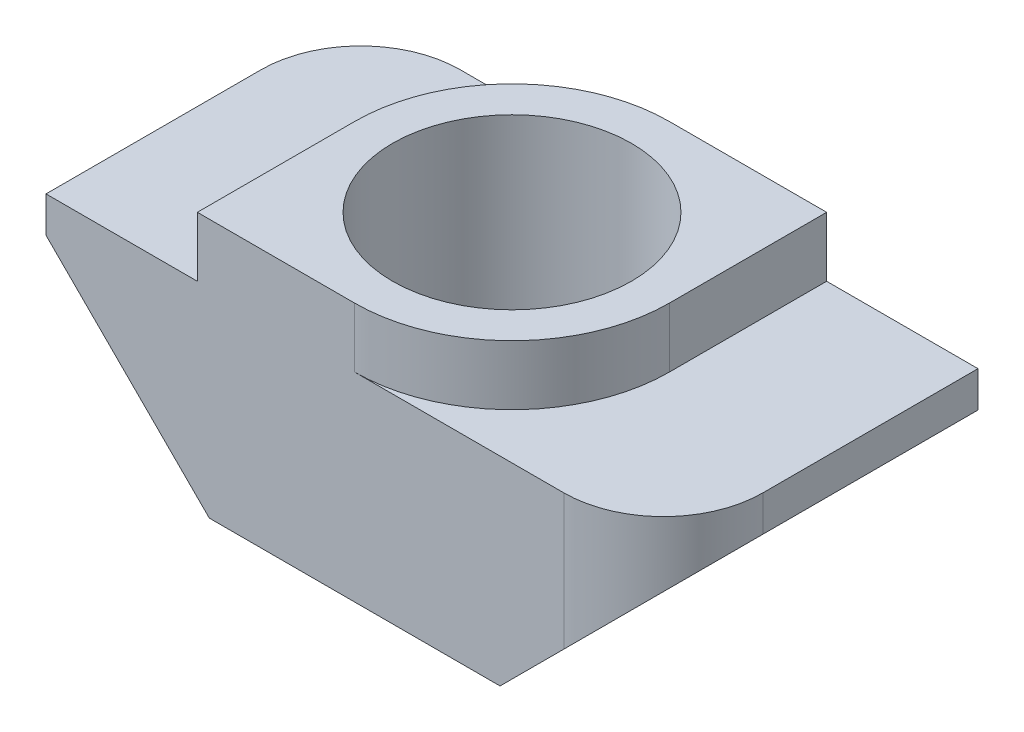
ISO-10303-21;
HEADER;
FILE_DESCRIPTION(('STEP AP214'),'2;1');
FILE_NAME('part.step','',(''),(''),'','','');
FILE_SCHEMA(('AUTOMOTIVE_DESIGN { 1 0 10303 214 1 1 1 1 }'));
ENDSEC;
DATA;
#1=APPLICATION_CONTEXT('core data for automotive mechanical design processes');
#2=APPLICATION_PROTOCOL_DEFINITION('international standard','automotive_design',2000,#1);
#3=PRODUCT_CONTEXT('',#1,'mechanical');
#4=PRODUCT('Part','Part','',(#3));
#5=PRODUCT_RELATED_PRODUCT_CATEGORY('part','',(#4));
#6=PRODUCT_DEFINITION_FORMATION('','',#4);
#7=PRODUCT_DEFINITION_CONTEXT('part definition',#1,'design');
#8=PRODUCT_DEFINITION('design','',#6,#7);
#9=PRODUCT_DEFINITION_SHAPE('','',#8);
#10=(LENGTH_UNIT() NAMED_UNIT(*) SI_UNIT(.MILLI.,.METRE.));
#11=(NAMED_UNIT(*) PLANE_ANGLE_UNIT() SI_UNIT($,.RADIAN.));
#12=(NAMED_UNIT(*) SI_UNIT($,.STERADIAN.) SOLID_ANGLE_UNIT());
#13=UNCERTAINTY_MEASURE_WITH_UNIT(LENGTH_MEASURE(1.E-05),#10,'distance_accuracy_value','');
#14=(GEOMETRIC_REPRESENTATION_CONTEXT(3) GLOBAL_UNCERTAINTY_ASSIGNED_CONTEXT((#13)) GLOBAL_UNIT_ASSIGNED_CONTEXT((#10,
#11,#12)) REPRESENTATION_CONTEXT('',''));
#15=CARTESIAN_POINT('',(0.,0.,0.));
#16=DIRECTION('',(0.,0.,1.));
#17=DIRECTION('',(1.,0.,0.));
#18=AXIS2_PLACEMENT_3D('',#15,#16,#17);
#19=CARTESIAN_POINT('',(0.,5.,0.));
#20=DIRECTION('',(0.,-1.,0.));
#21=DIRECTION('',(0.,0.,-1.));
#22=AXIS2_PLACEMENT_3D('',#19,#20,#21);
#23=PLANE('',#22);
#24=CARTESIAN_POINT('',(2.5,5.,-5.4));
#25=DIRECTION('',(0.,-1.,0.));
#26=DIRECTION('',(0.,0.,-1.));
#27=AXIS2_PLACEMENT_3D('',#24,#25,#26);
#28=CIRCLE('',#27,2.5);
#29=CARTESIAN_POINT('',(2.5,5.,-7.9));
#30=VERTEX_POINT('',#29);
#31=CARTESIAN_POINT('',(0.,5.,-5.4));
#32=VERTEX_POINT('',#31);
#33=EDGE_CURVE('E134',#30,#32,#28,.F.);
#34=ORIENTED_EDGE('',*,*,#33,.T.);
#35=DIRECTION('',(0.,0.,1.));
#36=VECTOR('',#35,1.);
#37=CARTESIAN_POINT('',(0.,5.,0.));
#38=LINE('',#37,#36);
#39=CARTESIAN_POINT('',(0.,5.,0.));
#40=VERTEX_POINT('',#39);
#41=EDGE_CURVE('E169',#32,#40,#38,.T.);
#42=ORIENTED_EDGE('',*,*,#41,.T.);
#43=DIRECTION('',(1.,0.,0.));
#44=VECTOR('',#43,1.);
#45=CARTESIAN_POINT('',(0.,5.,0.));
#46=LINE('',#45,#44);
#47=CARTESIAN_POINT('',(3.8,5.,0.));
#48=VERTEX_POINT('',#47);
#49=EDGE_CURVE('E160',#40,#48,#46,.T.);
#50=ORIENTED_EDGE('',*,*,#49,.T.);
#51=DIRECTION('',(0.,0.,1.));
#52=VECTOR('',#51,1.);
#53=CARTESIAN_POINT('',(3.8,5.,0.));
#54=LINE('',#53,#52);
#55=CARTESIAN_POINT('',(3.8,5.,-3.95));
#56=VERTEX_POINT('',#55);
#57=EDGE_CURVE('E211',#56,#48,#54,.T.);
#58=ORIENTED_EDGE('',*,*,#57,.F.);
#59=CARTESIAN_POINT('',(7.75,5.,-3.95));
#60=DIRECTION('',(0.,-1.,0.));
#61=DIRECTION('',(0.,0.,-1.));
#62=AXIS2_PLACEMENT_3D('',#59,#60,#61);
#63=CIRCLE('',#62,3.95);
#64=CARTESIAN_POINT('',(7.75,5.,-7.9));
#65=VERTEX_POINT('',#64);
#66=EDGE_CURVE('E155',#56,#65,#63,.T.);
#67=ORIENTED_EDGE('',*,*,#66,.T.);
#68=DIRECTION('',(-1.,0.,0.));
#69=VECTOR('',#68,1.);
#70=CARTESIAN_POINT('',(0.,5.,-7.9));
#71=LINE('',#70,#69);
#72=EDGE_CURVE('E147',#65,#30,#71,.T.);
#73=ORIENTED_EDGE('',*,*,#72,.T.);
#74=EDGE_LOOP('',(#34,#42,#50,#58,#67,#73));
#75=FACE_BOUND('',#74,.T.);
#76=ADVANCED_FACE('F35',(#75),#23,.F.);
#77=CARTESIAN_POINT('',(0.,5.,0.));
#78=DIRECTION('',(0.,0.,-1.));
#79=DIRECTION('',(-1.,0.,0.));
#80=AXIS2_PLACEMENT_3D('',#77,#78,#79);
#81=PLANE('',#80);
#82=DIRECTION('',(0.,-1.,0.));
#83=VECTOR('',#82,1.);
#84=CARTESIAN_POINT('',(13.,6.501,0.));
#85=LINE('',#84,#83);
#86=CARTESIAN_POINT('',(13.,5.,0.));
#87=VERTEX_POINT('',#86);
#88=CARTESIAN_POINT('',(13.,1.60000000000001,0.));
#89=VERTEX_POINT('',#88);
#90=EDGE_CURVE('E50',#87,#89,#85,.T.);
#91=ORIENTED_EDGE('',*,*,#90,.F.);
#92=CARTESIAN_POINT('',(7.75,5.,0.));
#93=VERTEX_POINT('',#92);
#94=EDGE_CURVE('E232',#93,#87,#46,.T.);
#95=ORIENTED_EDGE('',*,*,#94,.F.);
#96=DIRECTION('',(0.,-1.,0.));
#97=VECTOR('',#96,1.);
#98=CARTESIAN_POINT('',(7.75,6.5,0.));
#99=LINE('',#98,#97);
#100=CARTESIAN_POINT('',(7.75,6.5,0.));
#101=VERTEX_POINT('',#100);
#102=EDGE_CURVE('E229',#101,#93,#99,.T.);
#103=ORIENTED_EDGE('',*,*,#102,.F.);
#104=DIRECTION('',(1.,0.,0.));
#105=VECTOR('',#104,1.);
#106=CARTESIAN_POINT('',(0.,6.5,0.));
#107=LINE('',#106,#105);
#108=CARTESIAN_POINT('',(3.8,6.5,0.));
#109=VERTEX_POINT('',#108);
#110=EDGE_CURVE('E196',#109,#101,#107,.T.);
#111=ORIENTED_EDGE('',*,*,#110,.F.);
#112=DIRECTION('',(0.,-1.,0.));
#113=VECTOR('',#112,1.);
#114=CARTESIAN_POINT('',(3.8,6.5,0.));
#115=LINE('',#114,#113);
#116=EDGE_CURVE('E168',#109,#48,#115,.T.);
#117=ORIENTED_EDGE('',*,*,#116,.T.);
#118=ORIENTED_EDGE('',*,*,#49,.F.);
#119=DIRECTION('',(0.,-1.,0.));
#120=VECTOR('',#119,1.);
#121=CARTESIAN_POINT('',(0.,5.,0.));
#122=LINE('',#121,#120);
#123=CARTESIAN_POINT('',(0.,4.10000000000001,0.));
#124=VERTEX_POINT('',#123);
#125=EDGE_CURVE('E11',#40,#124,#122,.T.);
#126=ORIENTED_EDGE('',*,*,#125,.T.);
#127=DIRECTION('',(-0.707106781186546,0.707106781186549,0.));
#128=VECTOR('',#127,1.);
#129=CARTESIAN_POINT('',(0.,4.10000000000001,0.));
#130=LINE('',#129,#128);
#131=CARTESIAN_POINT('',(4.1,0.,0.));
#132=VERTEX_POINT('',#131);
#133=EDGE_CURVE('E188',#132,#124,#130,.T.);
#134=ORIENTED_EDGE('',*,*,#133,.F.);
#135=DIRECTION('',(1.,0.,0.));
#136=VECTOR('',#135,1.);
#137=CARTESIAN_POINT('',(0.,0.,0.));
#138=LINE('',#137,#136);
#139=CARTESIAN_POINT('',(11.4,0.,0.));
#140=VERTEX_POINT('',#139);
#141=EDGE_CURVE('E164',#132,#140,#138,.T.);
#142=ORIENTED_EDGE('',*,*,#141,.T.);
#143=DIRECTION('',(-0.707106781186546,-0.707106781186549,0.));
#144=VECTOR('',#143,1.);
#145=CARTESIAN_POINT('',(11.4,0.,0.));
#146=LINE('',#145,#144);
#147=EDGE_CURVE('E150',#89,#140,#146,.T.);
#148=ORIENTED_EDGE('',*,*,#147,.F.);
#149=EDGE_LOOP('',(#91,#95,#103,#111,#117,#118,#126,#134,#142,#148));
#150=FACE_BOUND('',#149,.T.);
#151=ADVANCED_FACE('F244',(#150),#81,.F.);
#152=CARTESIAN_POINT('',(0.,5.,-7.9));
#153=DIRECTION('',(0.,0.,1.));
#154=DIRECTION('',(1.,0.,0.));
#155=AXIS2_PLACEMENT_3D('',#152,#153,#154);
#156=PLANE('',#155);
#157=DIRECTION('',(0.,-1.,0.));
#158=VECTOR('',#157,1.);
#159=CARTESIAN_POINT('',(2.5,6.501,-7.9));
#160=LINE('',#159,#158);
#161=CARTESIAN_POINT('',(2.5,1.60000000000001,-7.9));
#162=VERTEX_POINT('',#161);
#163=EDGE_CURVE('E58',#30,#162,#160,.T.);
#164=ORIENTED_EDGE('',*,*,#163,.F.);
#165=ORIENTED_EDGE('',*,*,#72,.F.);
#166=DIRECTION('',(0.,-1.,0.));
#167=VECTOR('',#166,1.);
#168=CARTESIAN_POINT('',(7.75,6.5,-7.9));
#169=LINE('',#168,#167);
#170=CARTESIAN_POINT('',(7.75,6.5,-7.9));
#171=VERTEX_POINT('',#170);
#172=EDGE_CURVE('E223',#171,#65,#169,.T.);
#173=ORIENTED_EDGE('',*,*,#172,.F.);
#174=DIRECTION('',(1.,0.,0.));
#175=VECTOR('',#174,1.);
#176=CARTESIAN_POINT('',(0.,6.5,-7.9));
#177=LINE('',#176,#175);
#178=CARTESIAN_POINT('',(11.7,6.5,-7.9));
#179=VERTEX_POINT('',#178);
#180=EDGE_CURVE('E204',#171,#179,#177,.T.);
#181=ORIENTED_EDGE('',*,*,#180,.T.);
#182=DIRECTION('',(0.,-1.,0.));
#183=VECTOR('',#182,1.);
#184=CARTESIAN_POINT('',(11.7,6.5,-7.9));
#185=LINE('',#184,#183);
#186=CARTESIAN_POINT('',(11.7,5.,-7.9));
#187=VERTEX_POINT('',#186);
#188=EDGE_CURVE('E225',#179,#187,#185,.T.);
#189=ORIENTED_EDGE('',*,*,#188,.T.);
#190=CARTESIAN_POINT('',(15.5,5.,-7.9));
#191=VERTEX_POINT('',#190);
#192=EDGE_CURVE('E156',#191,#187,#71,.T.);
#193=ORIENTED_EDGE('',*,*,#192,.F.);
#194=DIRECTION('',(0.,-1.,0.));
#195=VECTOR('',#194,1.);
#196=CARTESIAN_POINT('',(15.5,5.,-7.9));
#197=LINE('',#196,#195);
#198=CARTESIAN_POINT('',(15.5,4.10000000000001,-7.9));
#199=VERTEX_POINT('',#198);
#200=EDGE_CURVE('E43',#191,#199,#197,.T.);
#201=ORIENTED_EDGE('',*,*,#200,.T.);
#202=DIRECTION('',(-0.707106781186546,-0.707106781186549,0.));
#203=VECTOR('',#202,1.);
#204=CARTESIAN_POINT('',(11.4,0.,-7.9));
#205=LINE('',#204,#203);
#206=CARTESIAN_POINT('',(11.4,0.,-7.9));
#207=VERTEX_POINT('',#206);
#208=EDGE_CURVE('E174',#199,#207,#205,.T.);
#209=ORIENTED_EDGE('',*,*,#208,.T.);
#210=DIRECTION('',(-1.,0.,0.));
#211=VECTOR('',#210,1.);
#212=CARTESIAN_POINT('',(0.,0.,-7.9));
#213=LINE('',#212,#211);
#214=CARTESIAN_POINT('',(4.1,0.,-7.9));
#215=VERTEX_POINT('',#214);
#216=EDGE_CURVE('E167',#207,#215,#213,.T.);
#217=ORIENTED_EDGE('',*,*,#216,.T.);
#218=DIRECTION('',(-0.707106781186546,0.707106781186549,0.));
#219=VECTOR('',#218,1.);
#220=CARTESIAN_POINT('',(0.,4.10000000000001,-7.9));
#221=LINE('',#220,#219);
#222=EDGE_CURVE('E149',#215,#162,#221,.T.);
#223=ORIENTED_EDGE('',*,*,#222,.T.);
#224=EDGE_LOOP('',(#164,#165,#173,#181,#189,#193,#201,#209,#217,#223));
#225=FACE_BOUND('',#224,.T.);
#226=ADVANCED_FACE('F146',(#225),#156,.F.);
#227=CARTESIAN_POINT('',(13.,5.,-2.5));
#228=DIRECTION('',(0.,-1.,0.));
#229=DIRECTION('',(0.,0.,-1.));
#230=AXIS2_PLACEMENT_3D('',#227,#228,#229);
#231=CIRCLE('',#230,2.5);
#232=CARTESIAN_POINT('',(15.5,5.,-2.5));
#233=VERTEX_POINT('',#232);
#234=EDGE_CURVE('E240',#87,#233,#231,.F.);
#235=ORIENTED_EDGE('',*,*,#234,.T.);
#236=DIRECTION('',(0.,0.,-1.));
#237=VECTOR('',#236,1.);
#238=CARTESIAN_POINT('',(15.5,5.,0.));
#239=LINE('',#238,#237);
#240=EDGE_CURVE('E157',#233,#191,#239,.T.);
#241=ORIENTED_EDGE('',*,*,#240,.T.);
#242=ORIENTED_EDGE('',*,*,#192,.T.);
#243=DIRECTION('',(0.,0.,1.));
#244=VECTOR('',#243,1.);
#245=CARTESIAN_POINT('',(11.7,5.,0.));
#246=LINE('',#245,#244);
#247=CARTESIAN_POINT('',(11.7,5.,-3.95));
#248=VERTEX_POINT('',#247);
#249=EDGE_CURVE('E218',#187,#248,#246,.T.);
#250=ORIENTED_EDGE('',*,*,#249,.T.);
#251=CARTESIAN_POINT('',(7.75,5.,-3.95));
#252=DIRECTION('',(0.,-1.,0.));
#253=DIRECTION('',(0.,0.,-1.));
#254=AXIS2_PLACEMENT_3D('',#251,#252,#253);
#255=CIRCLE('',#254,3.95);
#256=EDGE_CURVE('E214',#248,#93,#255,.T.);
#257=ORIENTED_EDGE('',*,*,#256,.T.);
#258=ORIENTED_EDGE('',*,*,#94,.T.);
#259=EDGE_LOOP('',(#235,#241,#242,#250,#257,#258));
#260=FACE_BOUND('',#259,.T.);
#261=ADVANCED_FACE('F239',(#260),#23,.F.);
#262=CARTESIAN_POINT('',(11.4,0.,-7.9));
#263=DIRECTION('',(-0.707106781186549,0.707106781186546,0.));
#264=DIRECTION('',(-0.707106781186546,-0.707106781186549,0.));
#265=AXIS2_PLACEMENT_3D('',#262,#263,#264);
#266=PLANE('',#265);
#267=CARTESIAN_POINT('',(13.,1.6,-2.5));
#268=DIRECTION('',(-0.707106781186549,0.707106781186546,0.));
#269=DIRECTION('',(-0.707106781186546,-0.707106781186549,0.));
#270=AXIS2_PLACEMENT_3D('',#267,#268,#269);
#271=ELLIPSE('',#270,3.53553390593274,2.5);
#272=CARTESIAN_POINT('',(15.5,4.10000000000001,-2.5));
#273=VERTEX_POINT('',#272);
#274=EDGE_CURVE('E257',#273,#89,#271,.F.);
#275=ORIENTED_EDGE('',*,*,#274,.T.);
#276=ORIENTED_EDGE('',*,*,#147,.T.);
#277=DIRECTION('',(0.,0.,1.));
#278=VECTOR('',#277,1.);
#279=CARTESIAN_POINT('',(11.4,0.,-7.9));
#280=LINE('',#279,#278);
#281=EDGE_CURVE('E185',#207,#140,#280,.T.);
#282=ORIENTED_EDGE('',*,*,#281,.F.);
#283=ORIENTED_EDGE('',*,*,#208,.F.);
#284=DIRECTION('',(0.,0.,1.));
#285=VECTOR('',#284,1.);
#286=CARTESIAN_POINT('',(15.5,4.10000000000001,-7.9));
#287=LINE('',#286,#285);
#288=EDGE_CURVE('E182',#199,#273,#287,.T.);
#289=ORIENTED_EDGE('',*,*,#288,.T.);
#290=EDGE_LOOP('',(#275,#276,#282,#283,#289));
#291=FACE_BOUND('',#290,.T.);
#292=ADVANCED_FACE('F256',(#291),#266,.F.);
#293=CARTESIAN_POINT('',(0.,4.10000000000001,-7.9));
#294=DIRECTION('',(0.707106781186549,0.707106781186546,0.));
#295=DIRECTION('',(-0.707106781186546,0.707106781186549,0.));
#296=AXIS2_PLACEMENT_3D('',#293,#294,#295);
#297=PLANE('',#296);
#298=CARTESIAN_POINT('',(2.5,1.6,-5.4));
#299=DIRECTION('',(0.707106781186549,0.707106781186546,0.));
#300=DIRECTION('',(0.707106781186546,-0.707106781186549,0.));
#301=AXIS2_PLACEMENT_3D('',#298,#299,#300);
#302=ELLIPSE('',#301,3.53553390593274,2.5);
#303=CARTESIAN_POINT('',(0.,4.10000000000001,-5.4));
#304=VERTEX_POINT('',#303);
#305=EDGE_CURVE('E141',#304,#162,#302,.F.);
#306=ORIENTED_EDGE('',*,*,#305,.T.);
#307=ORIENTED_EDGE('',*,*,#222,.F.);
#308=DIRECTION('',(0.,0.,1.));
#309=VECTOR('',#308,1.);
#310=CARTESIAN_POINT('',(4.1,0.,-7.9));
#311=LINE('',#310,#309);
#312=EDGE_CURVE('E252',#215,#132,#311,.T.);
#313=ORIENTED_EDGE('',*,*,#312,.T.);
#314=ORIENTED_EDGE('',*,*,#133,.T.);
#315=DIRECTION('',(0.,0.,1.));
#316=VECTOR('',#315,1.);
#317=CARTESIAN_POINT('',(0.,4.10000000000001,-7.9));
#318=LINE('',#317,#316);
#319=EDGE_CURVE('E215',#304,#124,#318,.T.);
#320=ORIENTED_EDGE('',*,*,#319,.F.);
#321=EDGE_LOOP('',(#306,#307,#313,#314,#320));
#322=FACE_BOUND('',#321,.T.);
#323=ADVANCED_FACE('F266',(#322),#297,.F.);
#324=CARTESIAN_POINT('',(0.,5.,0.));
#325=DIRECTION('',(1.,0.,0.));
#326=DIRECTION('',(0.,0.,-1.));
#327=AXIS2_PLACEMENT_3D('',#324,#325,#326);
#328=PLANE('',#327);
#329=ORIENTED_EDGE('',*,*,#41,.F.);
#330=DIRECTION('',(0.,-1.,0.));
#331=VECTOR('',#330,1.);
#332=CARTESIAN_POINT('',(0.,6.501,-5.4));
#333=LINE('',#332,#331);
#334=EDGE_CURVE('E137',#32,#304,#333,.T.);
#335=ORIENTED_EDGE('',*,*,#334,.T.);
#336=ORIENTED_EDGE('',*,*,#319,.T.);
#337=ORIENTED_EDGE('',*,*,#125,.F.);
#338=EDGE_LOOP('',(#329,#335,#336,#337));
#339=FACE_BOUND('',#338,.T.);
#340=ADVANCED_FACE('F37',(#339),#328,.F.);
#341=CARTESIAN_POINT('',(15.5,5.,0.));
#342=DIRECTION('',(-1.,0.,0.));
#343=DIRECTION('',(0.,0.,1.));
#344=AXIS2_PLACEMENT_3D('',#341,#342,#343);
#345=PLANE('',#344);
#346=ORIENTED_EDGE('',*,*,#240,.F.);
#347=DIRECTION('',(0.,-1.,0.));
#348=VECTOR('',#347,1.);
#349=CARTESIAN_POINT('',(15.5,6.501,-2.5));
#350=LINE('',#349,#348);
#351=EDGE_CURVE('E183',#233,#273,#350,.T.);
#352=ORIENTED_EDGE('',*,*,#351,.T.);
#353=ORIENTED_EDGE('',*,*,#288,.F.);
#354=ORIENTED_EDGE('',*,*,#200,.F.);
#355=EDGE_LOOP('',(#346,#352,#353,#354));
#356=FACE_BOUND('',#355,.T.);
#357=ADVANCED_FACE('F179',(#356),#345,.F.);
#358=CARTESIAN_POINT('',(0.,0.,0.));
#359=DIRECTION('',(0.,-1.,0.));
#360=DIRECTION('',(0.,0.,-1.));
#361=AXIS2_PLACEMENT_3D('',#358,#359,#360);
#362=PLANE('',#361);
#363=CARTESIAN_POINT('',(7.75,0.,-3.95));
#364=DIRECTION('',(0.,1.,0.));
#365=DIRECTION('',(0.,0.,1.));
#366=AXIS2_PLACEMENT_3D('',#363,#364,#365);
#367=CIRCLE('',#366,3.);
#368=CARTESIAN_POINT('',(7.75,0.,-0.950000000000001));
#369=VERTEX_POINT('',#368);
#370=EDGE_CURVE('E272',#369,#369,#367,.T.);
#371=ORIENTED_EDGE('',*,*,#370,.T.);
#372=EDGE_LOOP('',(#371));
#373=FACE_BOUND('',#372,.T.);
#374=ORIENTED_EDGE('',*,*,#312,.F.);
#375=ORIENTED_EDGE('',*,*,#216,.F.);
#376=ORIENTED_EDGE('',*,*,#281,.T.);
#377=ORIENTED_EDGE('',*,*,#141,.F.);
#378=EDGE_LOOP('',(#374,#375,#376,#377));
#379=FACE_BOUND('',#378,.T.);
#380=ADVANCED_FACE('F261',(#373,#379),#362,.T.);
#381=CARTESIAN_POINT('',(3.8,6.5,0.));
#382=DIRECTION('',(1.,0.,0.));
#383=DIRECTION('',(0.,0.,-1.));
#384=AXIS2_PLACEMENT_3D('',#381,#382,#383);
#385=PLANE('',#384);
#386=ORIENTED_EDGE('',*,*,#57,.T.);
#387=ORIENTED_EDGE('',*,*,#116,.F.);
#388=DIRECTION('',(0.,0.,1.));
#389=VECTOR('',#388,1.);
#390=CARTESIAN_POINT('',(3.8,6.5,0.));
#391=LINE('',#390,#389);
#392=CARTESIAN_POINT('',(3.8,6.5,-3.95));
#393=VERTEX_POINT('',#392);
#394=EDGE_CURVE('E193',#393,#109,#391,.T.);
#395=ORIENTED_EDGE('',*,*,#394,.F.);
#396=DIRECTION('',(0.,-1.,0.));
#397=VECTOR('',#396,1.);
#398=CARTESIAN_POINT('',(3.8,6.5,-3.95));
#399=LINE('',#398,#397);
#400=EDGE_CURVE('E210',#393,#56,#399,.T.);
#401=ORIENTED_EDGE('',*,*,#400,.T.);
#402=EDGE_LOOP('',(#386,#387,#395,#401));
#403=FACE_BOUND('',#402,.T.);
#404=ADVANCED_FACE('F312',(#403),#385,.F.);
#405=CARTESIAN_POINT('',(7.75,6.5,-3.95));
#406=DIRECTION('',(0.,-1.,0.));
#407=DIRECTION('',(0.,0.,-1.));
#408=AXIS2_PLACEMENT_3D('',#405,#406,#407);
#409=CYLINDRICAL_SURFACE('',#408,3.95);
#410=ORIENTED_EDGE('',*,*,#256,.F.);
#411=DIRECTION('',(0.,-1.,0.));
#412=VECTOR('',#411,1.);
#413=CARTESIAN_POINT('',(11.7,6.5,-3.95));
#414=LINE('',#413,#412);
#415=CARTESIAN_POINT('',(11.7,6.5,-3.95));
#416=VERTEX_POINT('',#415);
#417=EDGE_CURVE('E227',#416,#248,#414,.T.);
#418=ORIENTED_EDGE('',*,*,#417,.F.);
#419=CARTESIAN_POINT('',(7.75,6.5,-3.95));
#420=DIRECTION('',(0.,-1.,0.));
#421=DIRECTION('',(0.,0.,-1.));
#422=AXIS2_PLACEMENT_3D('',#419,#420,#421);
#423=CIRCLE('',#422,3.95);
#424=EDGE_CURVE('E198',#416,#101,#423,.T.);
#425=ORIENTED_EDGE('',*,*,#424,.T.);
#426=ORIENTED_EDGE('',*,*,#102,.T.);
#427=EDGE_LOOP('',(#410,#418,#425,#426));
#428=FACE_BOUND('',#427,.T.);
#429=ADVANCED_FACE('F331',(#428),#409,.T.);
#430=CARTESIAN_POINT('',(11.7,6.5,0.));
#431=DIRECTION('',(1.,0.,0.));
#432=DIRECTION('',(0.,0.,-1.));
#433=AXIS2_PLACEMENT_3D('',#430,#431,#432);
#434=PLANE('',#433);
#435=ORIENTED_EDGE('',*,*,#249,.F.);
#436=ORIENTED_EDGE('',*,*,#188,.F.);
#437=DIRECTION('',(0.,0.,1.));
#438=VECTOR('',#437,1.);
#439=CARTESIAN_POINT('',(11.7,6.5,0.));
#440=LINE('',#439,#438);
#441=EDGE_CURVE('E201',#179,#416,#440,.T.);
#442=ORIENTED_EDGE('',*,*,#441,.T.);
#443=ORIENTED_EDGE('',*,*,#417,.T.);
#444=EDGE_LOOP('',(#435,#436,#442,#443));
#445=FACE_BOUND('',#444,.T.);
#446=ADVANCED_FACE('F327',(#445),#434,.T.);
#447=CARTESIAN_POINT('',(7.75,6.5,-3.95));
#448=DIRECTION('',(0.,-1.,0.));
#449=DIRECTION('',(0.,0.,-1.));
#450=AXIS2_PLACEMENT_3D('',#447,#448,#449);
#451=CYLINDRICAL_SURFACE('',#450,3.95);
#452=ORIENTED_EDGE('',*,*,#66,.F.);
#453=ORIENTED_EDGE('',*,*,#400,.F.);
#454=CARTESIAN_POINT('',(7.75,6.5,-3.95));
#455=DIRECTION('',(0.,-1.,0.));
#456=DIRECTION('',(0.,0.,-1.));
#457=AXIS2_PLACEMENT_3D('',#454,#455,#456);
#458=CIRCLE('',#457,3.95);
#459=EDGE_CURVE('E207',#393,#171,#458,.T.);
#460=ORIENTED_EDGE('',*,*,#459,.T.);
#461=ORIENTED_EDGE('',*,*,#172,.T.);
#462=EDGE_LOOP('',(#452,#453,#460,#461));
#463=FACE_BOUND('',#462,.T.);
#464=ADVANCED_FACE('F323',(#463),#451,.T.);
#465=CARTESIAN_POINT('',(7.75,6.5,-3.95));
#466=DIRECTION('',(0.,-1.,0.));
#467=DIRECTION('',(0.,0.,-1.));
#468=AXIS2_PLACEMENT_3D('',#465,#466,#467);
#469=PLANE('',#468);
#470=CARTESIAN_POINT('',(7.75,6.5,-3.95));
#471=DIRECTION('',(0.,1.,0.));
#472=DIRECTION('',(0.,0.,1.));
#473=AXIS2_PLACEMENT_3D('',#470,#471,#472);
#474=CIRCLE('',#473,3.);
#475=CARTESIAN_POINT('',(7.75,6.5,-0.950000000000001));
#476=VERTEX_POINT('',#475);
#477=EDGE_CURVE('E270',#476,#476,#474,.T.);
#478=ORIENTED_EDGE('',*,*,#477,.F.);
#479=EDGE_LOOP('',(#478));
#480=FACE_BOUND('',#479,.T.);
#481=ORIENTED_EDGE('',*,*,#394,.T.);
#482=ORIENTED_EDGE('',*,*,#110,.T.);
#483=ORIENTED_EDGE('',*,*,#424,.F.);
#484=ORIENTED_EDGE('',*,*,#441,.F.);
#485=ORIENTED_EDGE('',*,*,#180,.F.);
#486=ORIENTED_EDGE('',*,*,#459,.F.);
#487=EDGE_LOOP('',(#481,#482,#483,#484,#485,#486));
#488=FACE_BOUND('',#487,.T.);
#489=ADVANCED_FACE('F320',(#480,#488),#469,.F.);
#490=CARTESIAN_POINT('',(2.5,6.501,-5.4));
#491=DIRECTION('',(0.,-1.,0.));
#492=DIRECTION('',(0.,0.,-1.));
#493=AXIS2_PLACEMENT_3D('',#490,#491,#492);
#494=CYLINDRICAL_SURFACE('',#493,2.5);
#495=ORIENTED_EDGE('',*,*,#163,.T.);
#496=ORIENTED_EDGE('',*,*,#305,.F.);
#497=ORIENTED_EDGE('',*,*,#334,.F.);
#498=ORIENTED_EDGE('',*,*,#33,.F.);
#499=EDGE_LOOP('',(#495,#496,#497,#498));
#500=FACE_BOUND('',#499,.T.);
#501=ADVANCED_FACE('F135',(#500),#494,.T.);
#502=CARTESIAN_POINT('',(13.,6.501,-2.5));
#503=DIRECTION('',(0.,-1.,0.));
#504=DIRECTION('',(0.,0.,-1.));
#505=AXIS2_PLACEMENT_3D('',#502,#503,#504);
#506=CYLINDRICAL_SURFACE('',#505,2.5);
#507=ORIENTED_EDGE('',*,*,#90,.T.);
#508=ORIENTED_EDGE('',*,*,#274,.F.);
#509=ORIENTED_EDGE('',*,*,#351,.F.);
#510=ORIENTED_EDGE('',*,*,#234,.F.);
#511=EDGE_LOOP('',(#507,#508,#509,#510));
#512=FACE_BOUND('',#511,.T.);
#513=ADVANCED_FACE('F283',(#512),#506,.T.);
#514=CARTESIAN_POINT('',(7.75,6.5,-3.95));
#515=DIRECTION('',(0.,-1.,0.));
#516=DIRECTION('',(0.,0.,-1.));
#517=AXIS2_PLACEMENT_3D('',#514,#515,#516);
#518=CYLINDRICAL_SURFACE('',#517,3.);
#519=ORIENTED_EDGE('',*,*,#477,.T.);
#520=EDGE_LOOP('',(#519));
#521=FACE_BOUND('',#520,.T.);
#522=ORIENTED_EDGE('',*,*,#370,.F.);
#523=EDGE_LOOP('',(#522));
#524=FACE_BOUND('',#523,.T.);
#525=ADVANCED_FACE('F281',(#521,#524),#518,.F.);
#526=CLOSED_SHELL('',(#76,#151,#226,#261,#292,#323,#340,#357,#380,#404,#429,#446,#464,#489,#501,
#513,#525));
#527=MANIFOLD_SOLID_BREP('B2',#526);
#528=ADVANCED_BREP_SHAPE_REPRESENTATION('',(#18,#527),#14);
#529=SHAPE_DEFINITION_REPRESENTATION(#9,#528);
ENDSEC;
END-ISO-10303-21;
